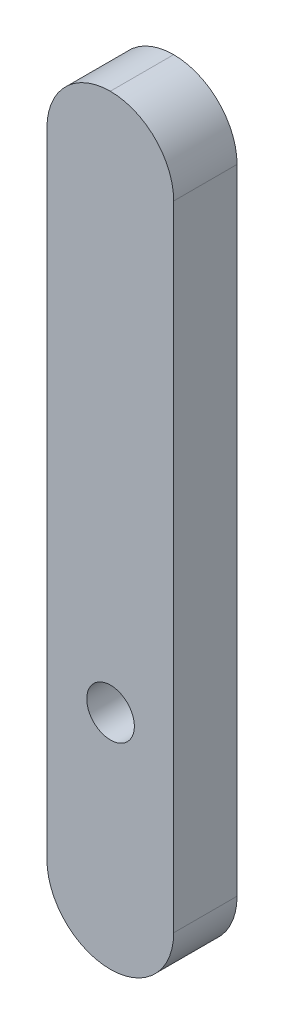
ISO-10303-21;
HEADER;
FILE_DESCRIPTION(('STEP AP214'),'2;1');
FILE_NAME('part.step','',(''),(''),'','','');
FILE_SCHEMA(('AUTOMOTIVE_DESIGN { 1 0 10303 214 1 1 1 1 }'));
ENDSEC;
DATA;
#1=APPLICATION_CONTEXT('core data for automotive mechanical design processes');
#2=APPLICATION_PROTOCOL_DEFINITION('international standard','automotive_design',2000,#1);
#3=PRODUCT_CONTEXT('',#1,'mechanical');
#4=PRODUCT('Part','Part','',(#3));
#5=PRODUCT_RELATED_PRODUCT_CATEGORY('part','',(#4));
#6=PRODUCT_DEFINITION_FORMATION('','',#4);
#7=PRODUCT_DEFINITION_CONTEXT('part definition',#1,'design');
#8=PRODUCT_DEFINITION('design','',#6,#7);
#9=PRODUCT_DEFINITION_SHAPE('','',#8);
#10=(LENGTH_UNIT() NAMED_UNIT(*) SI_UNIT(.MILLI.,.METRE.));
#11=(NAMED_UNIT(*) PLANE_ANGLE_UNIT() SI_UNIT($,.RADIAN.));
#12=(NAMED_UNIT(*) SI_UNIT($,.STERADIAN.) SOLID_ANGLE_UNIT());
#13=UNCERTAINTY_MEASURE_WITH_UNIT(LENGTH_MEASURE(1.E-05),#10,'distance_accuracy_value','');
#14=(GEOMETRIC_REPRESENTATION_CONTEXT(3) GLOBAL_UNCERTAINTY_ASSIGNED_CONTEXT((#13)) GLOBAL_UNIT_ASSIGNED_CONTEXT((#10,
#11,#12)) REPRESENTATION_CONTEXT('',''));
#15=CARTESIAN_POINT('',(0.,0.,0.));
#16=DIRECTION('',(0.,0.,1.));
#17=DIRECTION('',(1.,0.,0.));
#18=AXIS2_PLACEMENT_3D('',#15,#16,#17);
#19=CARTESIAN_POINT('',(-6.37281485873359,-22.2935466790038,6.35));
#20=DIRECTION('',(1.,0.,0.));
#21=DIRECTION('',(0.,0.,-1.));
#22=AXIS2_PLACEMENT_3D('',#19,#20,#21);
#23=PLANE('',#22);
#24=DIRECTION('',(0.,-1.,0.));
#25=VECTOR('',#24,1.);
#26=CARTESIAN_POINT('',(-6.37281485873359,-22.2935466790038,0.));
#27=LINE('',#26,#25);
#28=CARTESIAN_POINT('',(-6.37281485873359,47.5564533209962,0.));
#29=VERTEX_POINT('',#28);
#30=CARTESIAN_POINT('',(-6.37281485873359,-15.9435466790038,0.));
#31=VERTEX_POINT('',#30);
#32=EDGE_CURVE('E114',#29,#31,#27,.T.);
#33=ORIENTED_EDGE('',*,*,#32,.T.);
#34=DIRECTION('',(0.,0.,-1.));
#35=VECTOR('',#34,1.);
#36=CARTESIAN_POINT('',(-6.37281485873359,-15.9435466790038,6.35));
#37=LINE('',#36,#35);
#38=CARTESIAN_POINT('',(-6.37281485873359,-15.9435466790038,6.35));
#39=VERTEX_POINT('',#38);
#40=EDGE_CURVE('E11',#31,#39,#37,.F.);
#41=ORIENTED_EDGE('',*,*,#40,.T.);
#42=DIRECTION('',(0.,-1.,0.));
#43=VECTOR('',#42,1.);
#44=CARTESIAN_POINT('',(-6.37281485873359,-22.2935466790038,6.35));
#45=LINE('',#44,#43);
#46=CARTESIAN_POINT('',(-6.37281485873359,47.5564533209962,6.35));
#47=VERTEX_POINT('',#46);
#48=EDGE_CURVE('E113',#47,#39,#45,.T.);
#49=ORIENTED_EDGE('',*,*,#48,.F.);
#50=DIRECTION('',(0.,0.,-1.));
#51=VECTOR('',#50,1.);
#52=CARTESIAN_POINT('',(-6.37281485873359,47.5564533209962,6.35));
#53=LINE('',#52,#51);
#54=EDGE_CURVE('E42',#47,#29,#53,.T.);
#55=ORIENTED_EDGE('',*,*,#54,.T.);
#56=EDGE_LOOP('',(#33,#41,#49,#55));
#57=FACE_BOUND('',#56,.T.);
#58=ADVANCED_FACE('F33',(#57),#23,.F.);
#59=CARTESIAN_POINT('',(6.32718514126641,-22.2935466790038,6.35));
#60=DIRECTION('',(-1.,0.,0.));
#61=DIRECTION('',(0.,0.,1.));
#62=AXIS2_PLACEMENT_3D('',#59,#60,#61);
#63=PLANE('',#62);
#64=DIRECTION('',(0.,1.,0.));
#65=VECTOR('',#64,1.);
#66=CARTESIAN_POINT('',(6.32718514126641,-22.2935466790038,6.35));
#67=LINE('',#66,#65);
#68=CARTESIAN_POINT('',(6.32718514126641,-15.9435466790038,6.35));
#69=VERTEX_POINT('',#68);
#70=CARTESIAN_POINT('',(6.32718514126641,47.5564533209962,6.35));
#71=VERTEX_POINT('',#70);
#72=EDGE_CURVE('E106',#69,#71,#67,.T.);
#73=ORIENTED_EDGE('',*,*,#72,.F.);
#74=DIRECTION('',(0.,0.,-1.));
#75=VECTOR('',#74,1.);
#76=CARTESIAN_POINT('',(6.32718514126641,-15.9435466790038,6.35));
#77=LINE('',#76,#75);
#78=CARTESIAN_POINT('',(6.32718514126641,-15.9435466790038,0.));
#79=VERTEX_POINT('',#78);
#80=EDGE_CURVE('E91',#69,#79,#77,.T.);
#81=ORIENTED_EDGE('',*,*,#80,.T.);
#82=DIRECTION('',(0.,1.,0.));
#83=VECTOR('',#82,1.);
#84=CARTESIAN_POINT('',(6.32718514126641,-22.2935466790038,0.));
#85=LINE('',#84,#83);
#86=CARTESIAN_POINT('',(6.32718514126641,47.5564533209962,0.));
#87=VERTEX_POINT('',#86);
#88=EDGE_CURVE('E104',#79,#87,#85,.T.);
#89=ORIENTED_EDGE('',*,*,#88,.T.);
#90=DIRECTION('',(0.,0.,-1.));
#91=VECTOR('',#90,1.);
#92=CARTESIAN_POINT('',(6.32718514126641,47.5564533209962,6.35));
#93=LINE('',#92,#91);
#94=EDGE_CURVE('E108',#87,#71,#93,.F.);
#95=ORIENTED_EDGE('',*,*,#94,.T.);
#96=EDGE_LOOP('',(#73,#81,#89,#95));
#97=FACE_BOUND('',#96,.T.);
#98=ADVANCED_FACE('F102',(#97),#63,.F.);
#99=CARTESIAN_POINT('',(0.,0.,6.35));
#100=DIRECTION('',(0.,0.,-1.));
#101=DIRECTION('',(-1.,0.,0.));
#102=AXIS2_PLACEMENT_3D('',#99,#100,#101);
#103=PLANE('',#102);
#104=CARTESIAN_POINT('',(0.,0.,6.35));
#105=DIRECTION('',(0.,0.,-1.));
#106=DIRECTION('',(-1.,0.,0.));
#107=AXIS2_PLACEMENT_3D('',#104,#105,#106);
#108=CIRCLE('',#107,2.38390013337751);
#109=CARTESIAN_POINT('',(-2.38390013337751,0.,6.35));
#110=VERTEX_POINT('',#109);
#111=EDGE_CURVE('E118',#110,#110,#108,.T.);
#112=ORIENTED_EDGE('',*,*,#111,.T.);
#113=EDGE_LOOP('',(#112));
#114=FACE_BOUND('',#113,.T.);
#115=CARTESIAN_POINT('',(-0.0228148587335881,-15.9435466790038,6.35));
#116=DIRECTION('',(0.,0.,-1.));
#117=DIRECTION('',(-1.,0.,0.));
#118=AXIS2_PLACEMENT_3D('',#115,#116,#117);
#119=CIRCLE('',#118,6.35);
#120=CARTESIAN_POINT('',(-0.0228148587335881,-22.2935466790038,6.35));
#121=VERTEX_POINT('',#120);
#122=EDGE_CURVE('E57',#39,#121,#119,.F.);
#123=ORIENTED_EDGE('',*,*,#122,.T.);
#124=CARTESIAN_POINT('',(-0.0228148587335881,-15.9435466790038,6.35));
#125=DIRECTION('',(0.,0.,-1.));
#126=DIRECTION('',(-1.,0.,0.));
#127=AXIS2_PLACEMENT_3D('',#124,#125,#126);
#128=CIRCLE('',#127,6.35);
#129=EDGE_CURVE('E129',#121,#69,#128,.F.);
#130=ORIENTED_EDGE('',*,*,#129,.T.);
#131=ORIENTED_EDGE('',*,*,#72,.T.);
#132=CARTESIAN_POINT('',(-0.0228148587335881,47.5564533209962,6.35));
#133=DIRECTION('',(0.,0.,-1.));
#134=DIRECTION('',(-1.,0.,0.));
#135=AXIS2_PLACEMENT_3D('',#132,#133,#134);
#136=CIRCLE('',#135,6.35);
#137=CARTESIAN_POINT('',(-0.0228148587335881,53.9064533209962,6.35));
#138=VERTEX_POINT('',#137);
#139=EDGE_CURVE('E50',#71,#138,#136,.F.);
#140=ORIENTED_EDGE('',*,*,#139,.T.);
#141=CARTESIAN_POINT('',(-0.0228148587335881,47.5564533209962,6.35));
#142=DIRECTION('',(0.,0.,-1.));
#143=DIRECTION('',(-1.,0.,0.));
#144=AXIS2_PLACEMENT_3D('',#141,#142,#143);
#145=CIRCLE('',#144,6.35);
#146=EDGE_CURVE('E96',#138,#47,#145,.F.);
#147=ORIENTED_EDGE('',*,*,#146,.T.);
#148=ORIENTED_EDGE('',*,*,#48,.T.);
#149=EDGE_LOOP('',(#123,#130,#131,#140,#147,#148));
#150=FACE_BOUND('',#149,.T.);
#151=ADVANCED_FACE('F142',(#114,#150),#103,.F.);
#152=CARTESIAN_POINT('',(0.,0.,0.));
#153=DIRECTION('',(0.,0.,-1.));
#154=DIRECTION('',(-1.,0.,0.));
#155=AXIS2_PLACEMENT_3D('',#152,#153,#154);
#156=PLANE('',#155);
#157=CARTESIAN_POINT('',(0.,0.,0.));
#158=DIRECTION('',(0.,0.,-1.));
#159=DIRECTION('',(-1.,0.,0.));
#160=AXIS2_PLACEMENT_3D('',#157,#158,#159);
#161=CIRCLE('',#160,2.38390013337751);
#162=CARTESIAN_POINT('',(-2.38390013337751,0.,0.));
#163=VERTEX_POINT('',#162);
#164=EDGE_CURVE('E131',#163,#163,#161,.T.);
#165=ORIENTED_EDGE('',*,*,#164,.F.);
#166=EDGE_LOOP('',(#165));
#167=FACE_BOUND('',#166,.T.);
#168=ORIENTED_EDGE('',*,*,#88,.F.);
#169=CARTESIAN_POINT('',(-0.0228148587335881,-15.9435466790038,0.));
#170=DIRECTION('',(0.,0.,-1.));
#171=DIRECTION('',(-1.,0.,0.));
#172=AXIS2_PLACEMENT_3D('',#169,#170,#171);
#173=CIRCLE('',#172,6.35);
#174=CARTESIAN_POINT('',(-0.0228148587335881,-22.2935466790038,0.));
#175=VERTEX_POINT('',#174);
#176=EDGE_CURVE('E87',#79,#175,#173,.T.);
#177=ORIENTED_EDGE('',*,*,#176,.T.);
#178=CARTESIAN_POINT('',(-0.0228148587335881,-15.9435466790038,0.));
#179=DIRECTION('',(0.,0.,-1.));
#180=DIRECTION('',(-1.,0.,0.));
#181=AXIS2_PLACEMENT_3D('',#178,#179,#180);
#182=CIRCLE('',#181,6.35);
#183=EDGE_CURVE('E97',#175,#31,#182,.T.);
#184=ORIENTED_EDGE('',*,*,#183,.T.);
#185=ORIENTED_EDGE('',*,*,#32,.F.);
#186=CARTESIAN_POINT('',(-0.0228148587335881,47.5564533209962,0.));
#187=DIRECTION('',(0.,0.,-1.));
#188=DIRECTION('',(-1.,0.,0.));
#189=AXIS2_PLACEMENT_3D('',#186,#187,#188);
#190=CIRCLE('',#189,6.35);
#191=CARTESIAN_POINT('',(-0.0228148587335881,53.9064533209962,0.));
#192=VERTEX_POINT('',#191);
#193=EDGE_CURVE('E107',#29,#192,#190,.T.);
#194=ORIENTED_EDGE('',*,*,#193,.T.);
#195=CARTESIAN_POINT('',(-0.0228148587335881,47.5564533209962,0.));
#196=DIRECTION('',(0.,0.,-1.));
#197=DIRECTION('',(-1.,0.,0.));
#198=AXIS2_PLACEMENT_3D('',#195,#196,#197);
#199=CIRCLE('',#198,6.35);
#200=EDGE_CURVE('E112',#192,#87,#199,.T.);
#201=ORIENTED_EDGE('',*,*,#200,.T.);
#202=EDGE_LOOP('',(#168,#177,#184,#185,#194,#201));
#203=FACE_BOUND('',#202,.T.);
#204=ADVANCED_FACE('F110',(#167,#203),#156,.T.);
#205=CARTESIAN_POINT('',(0.,0.,6.35));
#206=DIRECTION('',(0.,0.,-1.));
#207=DIRECTION('',(-1.,0.,0.));
#208=AXIS2_PLACEMENT_3D('',#205,#206,#207);
#209=CYLINDRICAL_SURFACE('',#208,2.38390013337751);
#210=ORIENTED_EDGE('',*,*,#111,.F.);
#211=EDGE_LOOP('',(#210));
#212=FACE_BOUND('',#211,.T.);
#213=ORIENTED_EDGE('',*,*,#164,.T.);
#214=EDGE_LOOP('',(#213));
#215=FACE_BOUND('',#214,.T.);
#216=ADVANCED_FACE('F153',(#212,#215),#209,.F.);
#217=CARTESIAN_POINT('',(-0.0228148587335881,-15.9435466790038,6.35));
#218=DIRECTION('',(0.,0.,-1.));
#219=DIRECTION('',(-1.,0.,0.));
#220=AXIS2_PLACEMENT_3D('',#217,#218,#219);
#221=CYLINDRICAL_SURFACE('',#220,6.35);
#222=DIRECTION('',(0.,0.,-1.));
#223=VECTOR('',#222,1.);
#224=CARTESIAN_POINT('',(-0.0228148587335881,-22.2935466790038,6.35));
#225=LINE('',#224,#223);
#226=EDGE_CURVE('E92',#121,#175,#225,.T.);
#227=ORIENTED_EDGE('',*,*,#226,.F.);
#228=ORIENTED_EDGE('',*,*,#122,.F.);
#229=ORIENTED_EDGE('',*,*,#40,.F.);
#230=ORIENTED_EDGE('',*,*,#183,.F.);
#231=EDGE_LOOP('',(#227,#228,#229,#230));
#232=FACE_BOUND('',#231,.T.);
#233=ADVANCED_FACE('F147',(#232),#221,.T.);
#234=CARTESIAN_POINT('',(-0.0228148587335881,-15.9435466790038,6.35));
#235=DIRECTION('',(0.,0.,-1.));
#236=DIRECTION('',(-1.,0.,0.));
#237=AXIS2_PLACEMENT_3D('',#234,#235,#236);
#238=CYLINDRICAL_SURFACE('',#237,6.35);
#239=ORIENTED_EDGE('',*,*,#129,.F.);
#240=ORIENTED_EDGE('',*,*,#226,.T.);
#241=ORIENTED_EDGE('',*,*,#176,.F.);
#242=ORIENTED_EDGE('',*,*,#80,.F.);
#243=EDGE_LOOP('',(#239,#240,#241,#242));
#244=FACE_BOUND('',#243,.T.);
#245=ADVANCED_FACE('F90',(#244),#238,.T.);
#246=CARTESIAN_POINT('',(-0.0228148587335881,47.5564533209962,6.35));
#247=DIRECTION('',(0.,0.,-1.));
#248=DIRECTION('',(-1.,0.,0.));
#249=AXIS2_PLACEMENT_3D('',#246,#247,#248);
#250=CYLINDRICAL_SURFACE('',#249,6.35);
#251=ORIENTED_EDGE('',*,*,#54,.F.);
#252=ORIENTED_EDGE('',*,*,#146,.F.);
#253=DIRECTION('',(0.,0.,-1.));
#254=VECTOR('',#253,1.);
#255=CARTESIAN_POINT('',(-0.0228148587335881,53.9064533209962,6.35));
#256=LINE('',#255,#254);
#257=EDGE_CURVE('E37',#192,#138,#256,.F.);
#258=ORIENTED_EDGE('',*,*,#257,.F.);
#259=ORIENTED_EDGE('',*,*,#193,.F.);
#260=EDGE_LOOP('',(#251,#252,#258,#259));
#261=FACE_BOUND('',#260,.T.);
#262=ADVANCED_FACE('F35',(#261),#250,.T.);
#263=CARTESIAN_POINT('',(-0.0228148587335881,47.5564533209962,6.35));
#264=DIRECTION('',(0.,0.,-1.));
#265=DIRECTION('',(-1.,0.,0.));
#266=AXIS2_PLACEMENT_3D('',#263,#264,#265);
#267=CYLINDRICAL_SURFACE('',#266,6.35);
#268=ORIENTED_EDGE('',*,*,#139,.F.);
#269=ORIENTED_EDGE('',*,*,#94,.F.);
#270=ORIENTED_EDGE('',*,*,#200,.F.);
#271=ORIENTED_EDGE('',*,*,#257,.T.);
#272=EDGE_LOOP('',(#268,#269,#270,#271));
#273=FACE_BOUND('',#272,.T.);
#274=ADVANCED_FACE('F137',(#273),#267,.T.);
#275=CLOSED_SHELL('',(#58,#98,#151,#204,#216,#233,#245,#262,#274));
#276=MANIFOLD_SOLID_BREP('B2',#275);
#277=ADVANCED_BREP_SHAPE_REPRESENTATION('',(#18,#276),#14);
#278=SHAPE_DEFINITION_REPRESENTATION(#9,#277);
ENDSEC;
END-ISO-10303-21;
